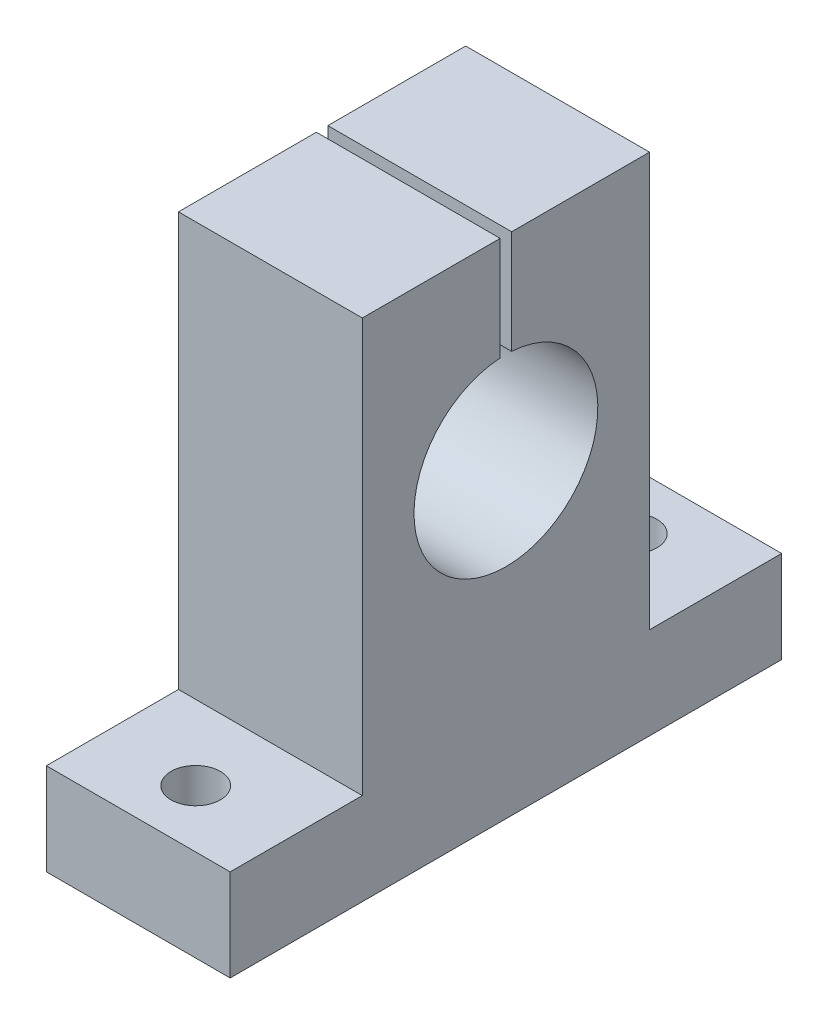
ISO-10303-21;
HEADER;
FILE_DESCRIPTION(('STEP AP214'),'2;1');
FILE_NAME('part.step','',(''),(''),'','','');
FILE_SCHEMA(('AUTOMOTIVE_DESIGN { 1 0 10303 214 1 1 1 1 }'));
ENDSEC;
DATA;
#1=APPLICATION_CONTEXT('core data for automotive mechanical design processes');
#2=APPLICATION_PROTOCOL_DEFINITION('international standard','automotive_design',2000,#1);
#3=PRODUCT_CONTEXT('',#1,'mechanical');
#4=PRODUCT('Part','Part','',(#3));
#5=PRODUCT_RELATED_PRODUCT_CATEGORY('part','',(#4));
#6=PRODUCT_DEFINITION_FORMATION('','',#4);
#7=PRODUCT_DEFINITION_CONTEXT('part definition',#1,'design');
#8=PRODUCT_DEFINITION('design','',#6,#7);
#9=PRODUCT_DEFINITION_SHAPE('','',#8);
#10=(LENGTH_UNIT() NAMED_UNIT(*) SI_UNIT(.MILLI.,.METRE.));
#11=(NAMED_UNIT(*) PLANE_ANGLE_UNIT() SI_UNIT($,.RADIAN.));
#12=(NAMED_UNIT(*) SI_UNIT($,.STERADIAN.) SOLID_ANGLE_UNIT());
#13=UNCERTAINTY_MEASURE_WITH_UNIT(LENGTH_MEASURE(1.E-05),#10,'distance_accuracy_value','');
#14=(GEOMETRIC_REPRESENTATION_CONTEXT(3) GLOBAL_UNCERTAINTY_ASSIGNED_CONTEXT((#13)) GLOBAL_UNIT_ASSIGNED_CONTEXT((#10,
#11,#12)) REPRESENTATION_CONTEXT('',''));
#15=CARTESIAN_POINT('',(0.,0.,0.));
#16=DIRECTION('',(0.,0.,1.));
#17=DIRECTION('',(1.,0.,0.));
#18=AXIS2_PLACEMENT_3D('',#15,#16,#17);
#19=CARTESIAN_POINT('',(16.,8.,24.));
#20=DIRECTION('',(0.,-1.,0.));
#21=DIRECTION('',(0.,0.,-1.));
#22=AXIS2_PLACEMENT_3D('',#19,#20,#21);
#23=PLANE('',#22);
#24=DIRECTION('',(0.,0.,1.));
#25=VECTOR('',#24,1.);
#26=CARTESIAN_POINT('',(0.,8.,24.));
#27=LINE('',#26,#25);
#28=CARTESIAN_POINT('',(0.,8.,12.5));
#29=VERTEX_POINT('',#28);
#30=CARTESIAN_POINT('',(0.,8.,24.));
#31=VERTEX_POINT('',#30);
#32=EDGE_CURVE('E100',#29,#31,#27,.T.);
#33=ORIENTED_EDGE('',*,*,#32,.T.);
#34=DIRECTION('',(-1.,0.,0.));
#35=VECTOR('',#34,1.);
#36=CARTESIAN_POINT('',(16.,8.,24.));
#37=LINE('',#36,#35);
#38=CARTESIAN_POINT('',(16.,8.,24.));
#39=VERTEX_POINT('',#38);
#40=EDGE_CURVE('E153',#39,#31,#37,.T.);
#41=ORIENTED_EDGE('',*,*,#40,.F.);
#42=DIRECTION('',(0.,0.,1.));
#43=VECTOR('',#42,1.);
#44=CARTESIAN_POINT('',(16.,8.,24.));
#45=LINE('',#44,#43);
#46=CARTESIAN_POINT('',(16.,8.,12.5));
#47=VERTEX_POINT('',#46);
#48=EDGE_CURVE('E53',#47,#39,#45,.T.);
#49=ORIENTED_EDGE('',*,*,#48,.F.);
#50=DIRECTION('',(-1.,0.,0.));
#51=VECTOR('',#50,1.);
#52=CARTESIAN_POINT('',(16.,8.,12.5));
#53=LINE('',#52,#51);
#54=EDGE_CURVE('E149',#47,#29,#53,.T.);
#55=ORIENTED_EDGE('',*,*,#54,.T.);
#56=EDGE_LOOP('',(#33,#41,#49,#55));
#57=FACE_BOUND('',#56,.T.);
#58=CARTESIAN_POINT('',(8.,8.,19.));
#59=DIRECTION('',(0.,1.,0.));
#60=DIRECTION('',(0.,0.,1.));
#61=AXIS2_PLACEMENT_3D('',#58,#59,#60);
#62=CIRCLE('',#61,2.14999999999999);
#63=CARTESIAN_POINT('',(8.,8.,21.15));
#64=VERTEX_POINT('',#63);
#65=EDGE_CURVE('E252',#64,#64,#62,.T.);
#66=ORIENTED_EDGE('',*,*,#65,.F.);
#67=EDGE_LOOP('',(#66));
#68=FACE_BOUND('',#67,.T.);
#69=ADVANCED_FACE('F36',(#57,#68),#23,.F.);
#70=CARTESIAN_POINT('',(16.,0.,24.));
#71=DIRECTION('',(0.,0.,-1.));
#72=DIRECTION('',(-1.,0.,0.));
#73=AXIS2_PLACEMENT_3D('',#70,#71,#72);
#74=PLANE('',#73);
#75=DIRECTION('',(0.,-1.,0.));
#76=VECTOR('',#75,1.);
#77=CARTESIAN_POINT('',(0.,0.,24.));
#78=LINE('',#77,#76);
#79=CARTESIAN_POINT('',(0.,0.,24.));
#80=VERTEX_POINT('',#79);
#81=EDGE_CURVE('E157',#31,#80,#78,.T.);
#82=ORIENTED_EDGE('',*,*,#81,.T.);
#83=DIRECTION('',(-1.,0.,0.));
#84=VECTOR('',#83,1.);
#85=CARTESIAN_POINT('',(16.,0.,24.));
#86=LINE('',#85,#84);
#87=CARTESIAN_POINT('',(16.,0.,24.));
#88=VERTEX_POINT('',#87);
#89=EDGE_CURVE('E11',#88,#80,#86,.T.);
#90=ORIENTED_EDGE('',*,*,#89,.F.);
#91=DIRECTION('',(0.,-1.,0.));
#92=VECTOR('',#91,1.);
#93=CARTESIAN_POINT('',(16.,0.,24.));
#94=LINE('',#93,#92);
#95=EDGE_CURVE('E180',#39,#88,#94,.T.);
#96=ORIENTED_EDGE('',*,*,#95,.F.);
#97=ORIENTED_EDGE('',*,*,#40,.T.);
#98=EDGE_LOOP('',(#82,#90,#96,#97));
#99=FACE_BOUND('',#98,.T.);
#100=ADVANCED_FACE('F38',(#99),#74,.F.);
#101=CARTESIAN_POINT('',(16.,0.,24.));
#102=DIRECTION('',(0.,1.,0.));
#103=DIRECTION('',(0.,0.,1.));
#104=AXIS2_PLACEMENT_3D('',#101,#102,#103);
#105=PLANE('',#104);
#106=CARTESIAN_POINT('',(8.,0.,-19.));
#107=DIRECTION('',(0.,1.,0.));
#108=DIRECTION('',(0.,0.,1.));
#109=AXIS2_PLACEMENT_3D('',#106,#107,#108);
#110=CIRCLE('',#109,2.15);
#111=CARTESIAN_POINT('',(8.,0.,-16.85));
#112=VERTEX_POINT('',#111);
#113=EDGE_CURVE('E254',#112,#112,#110,.T.);
#114=ORIENTED_EDGE('',*,*,#113,.T.);
#115=EDGE_LOOP('',(#114));
#116=FACE_BOUND('',#115,.T.);
#117=CARTESIAN_POINT('',(8.,0.,19.));
#118=DIRECTION('',(0.,1.,0.));
#119=DIRECTION('',(0.,0.,1.));
#120=AXIS2_PLACEMENT_3D('',#117,#118,#119);
#121=CIRCLE('',#120,2.15);
#122=CARTESIAN_POINT('',(8.,0.,21.15));
#123=VERTEX_POINT('',#122);
#124=EDGE_CURVE('E161',#123,#123,#121,.T.);
#125=ORIENTED_EDGE('',*,*,#124,.T.);
#126=EDGE_LOOP('',(#125));
#127=FACE_BOUND('',#126,.T.);
#128=DIRECTION('',(0.,0.,-1.));
#129=VECTOR('',#128,1.);
#130=CARTESIAN_POINT('',(0.,0.,24.));
#131=LINE('',#130,#129);
#132=CARTESIAN_POINT('',(0.,0.,-24.));
#133=VERTEX_POINT('',#132);
#134=EDGE_CURVE('E160',#80,#133,#131,.T.);
#135=ORIENTED_EDGE('',*,*,#134,.T.);
#136=DIRECTION('',(-1.,0.,0.));
#137=VECTOR('',#136,1.);
#138=CARTESIAN_POINT('',(16.,0.,-24.));
#139=LINE('',#138,#137);
#140=CARTESIAN_POINT('',(16.,0.,-24.));
#141=VERTEX_POINT('',#140);
#142=EDGE_CURVE('E45',#141,#133,#139,.T.);
#143=ORIENTED_EDGE('',*,*,#142,.F.);
#144=DIRECTION('',(0.,0.,-1.));
#145=VECTOR('',#144,1.);
#146=CARTESIAN_POINT('',(16.,0.,24.));
#147=LINE('',#146,#145);
#148=EDGE_CURVE('E108',#88,#141,#147,.T.);
#149=ORIENTED_EDGE('',*,*,#148,.F.);
#150=ORIENTED_EDGE('',*,*,#89,.T.);
#151=EDGE_LOOP('',(#135,#143,#149,#150));
#152=FACE_BOUND('',#151,.T.);
#153=ADVANCED_FACE('F277',(#116,#127,#152),#105,.F.);
#154=CARTESIAN_POINT('',(16.,0.,-24.));
#155=DIRECTION('',(0.,0.,1.));
#156=DIRECTION('',(0.,-1.,0.));
#157=AXIS2_PLACEMENT_3D('',#154,#155,#156);
#158=PLANE('',#157);
#159=DIRECTION('',(0.,1.,0.));
#160=VECTOR('',#159,1.);
#161=CARTESIAN_POINT('',(0.,0.,-24.));
#162=LINE('',#161,#160);
#163=CARTESIAN_POINT('',(0.,8.00000000000001,-24.));
#164=VERTEX_POINT('',#163);
#165=EDGE_CURVE('E163',#133,#164,#162,.T.);
#166=ORIENTED_EDGE('',*,*,#165,.T.);
#167=DIRECTION('',(-1.,0.,0.));
#168=VECTOR('',#167,1.);
#169=CARTESIAN_POINT('',(16.,8.00000000000001,-24.));
#170=LINE('',#169,#168);
#171=CARTESIAN_POINT('',(16.,8.00000000000001,-24.));
#172=VERTEX_POINT('',#171);
#173=EDGE_CURVE('E199',#172,#164,#170,.T.);
#174=ORIENTED_EDGE('',*,*,#173,.F.);
#175=DIRECTION('',(0.,1.,0.));
#176=VECTOR('',#175,1.);
#177=CARTESIAN_POINT('',(16.,0.,-24.));
#178=LINE('',#177,#176);
#179=EDGE_CURVE('E207',#141,#172,#178,.T.);
#180=ORIENTED_EDGE('',*,*,#179,.F.);
#181=ORIENTED_EDGE('',*,*,#142,.T.);
#182=EDGE_LOOP('',(#166,#174,#180,#181));
#183=FACE_BOUND('',#182,.T.);
#184=ADVANCED_FACE('F205',(#183),#158,.F.);
#185=CARTESIAN_POINT('',(16.,8.,-12.5));
#186=DIRECTION('',(0.,-1.,0.));
#187=DIRECTION('',(0.,0.,-1.));
#188=AXIS2_PLACEMENT_3D('',#185,#186,#187);
#189=PLANE('',#188);
#190=CARTESIAN_POINT('',(8.,8.00000000000001,-19.));
#191=DIRECTION('',(0.,1.,0.));
#192=DIRECTION('',(0.,0.,1.));
#193=AXIS2_PLACEMENT_3D('',#190,#191,#192);
#194=CIRCLE('',#193,2.14999999999999);
#195=CARTESIAN_POINT('',(8.,8.00000000000001,-16.85));
#196=VERTEX_POINT('',#195);
#197=EDGE_CURVE('E259',#196,#196,#194,.T.);
#198=ORIENTED_EDGE('',*,*,#197,.F.);
#199=EDGE_LOOP('',(#198));
#200=FACE_BOUND('',#199,.T.);
#201=DIRECTION('',(0.,0.,1.));
#202=VECTOR('',#201,1.);
#203=CARTESIAN_POINT('',(0.,8.,-12.5));
#204=LINE('',#203,#202);
#205=CARTESIAN_POINT('',(0.,8.,-12.5));
#206=VERTEX_POINT('',#205);
#207=EDGE_CURVE('E165',#164,#206,#204,.T.);
#208=ORIENTED_EDGE('',*,*,#207,.T.);
#209=DIRECTION('',(-1.,0.,0.));
#210=VECTOR('',#209,1.);
#211=CARTESIAN_POINT('',(16.,8.,-12.5));
#212=LINE('',#211,#210);
#213=CARTESIAN_POINT('',(16.,8.,-12.5));
#214=VERTEX_POINT('',#213);
#215=EDGE_CURVE('E196',#214,#206,#212,.T.);
#216=ORIENTED_EDGE('',*,*,#215,.F.);
#217=DIRECTION('',(0.,0.,1.));
#218=VECTOR('',#217,1.);
#219=CARTESIAN_POINT('',(16.,8.,-12.5));
#220=LINE('',#219,#218);
#221=EDGE_CURVE('E225',#172,#214,#220,.T.);
#222=ORIENTED_EDGE('',*,*,#221,.F.);
#223=ORIENTED_EDGE('',*,*,#173,.T.);
#224=EDGE_LOOP('',(#208,#216,#222,#223));
#225=FACE_BOUND('',#224,.T.);
#226=ADVANCED_FACE('F216',(#200,#225),#189,.F.);
#227=CARTESIAN_POINT('',(16.,8.,-12.5));
#228=DIRECTION('',(0.,0.,1.));
#229=DIRECTION('',(0.,-1.,0.));
#230=AXIS2_PLACEMENT_3D('',#227,#228,#229);
#231=PLANE('',#230);
#232=DIRECTION('',(0.,1.,0.));
#233=VECTOR('',#232,1.);
#234=CARTESIAN_POINT('',(0.,8.,-12.5));
#235=LINE('',#234,#233);
#236=CARTESIAN_POINT('',(0.,44.,-12.5));
#237=VERTEX_POINT('',#236);
#238=EDGE_CURVE('E167',#206,#237,#235,.T.);
#239=ORIENTED_EDGE('',*,*,#238,.T.);
#240=DIRECTION('',(-1.,0.,0.));
#241=VECTOR('',#240,1.);
#242=CARTESIAN_POINT('',(16.,44.,-12.5));
#243=LINE('',#242,#241);
#244=CARTESIAN_POINT('',(16.,44.,-12.5));
#245=VERTEX_POINT('',#244);
#246=EDGE_CURVE('E193',#245,#237,#243,.T.);
#247=ORIENTED_EDGE('',*,*,#246,.F.);
#248=DIRECTION('',(0.,1.,0.));
#249=VECTOR('',#248,1.);
#250=CARTESIAN_POINT('',(16.,8.,-12.5));
#251=LINE('',#250,#249);
#252=EDGE_CURVE('E222',#214,#245,#251,.T.);
#253=ORIENTED_EDGE('',*,*,#252,.F.);
#254=ORIENTED_EDGE('',*,*,#215,.T.);
#255=EDGE_LOOP('',(#239,#247,#253,#254));
#256=FACE_BOUND('',#255,.T.);
#257=ADVANCED_FACE('F220',(#256),#231,.F.);
#258=CARTESIAN_POINT('',(16.,44.,-0.5));
#259=DIRECTION('',(0.,-1.,0.));
#260=DIRECTION('',(0.,0.,-1.));
#261=AXIS2_PLACEMENT_3D('',#258,#259,#260);
#262=PLANE('',#261);
#263=DIRECTION('',(0.,0.,1.));
#264=VECTOR('',#263,1.);
#265=CARTESIAN_POINT('',(0.,44.,-0.5));
#266=LINE('',#265,#264);
#267=CARTESIAN_POINT('',(0.,44.,-0.5));
#268=VERTEX_POINT('',#267);
#269=EDGE_CURVE('E169',#237,#268,#266,.T.);
#270=ORIENTED_EDGE('',*,*,#269,.T.);
#271=DIRECTION('',(-1.,0.,0.));
#272=VECTOR('',#271,1.);
#273=CARTESIAN_POINT('',(16.,44.,-0.5));
#274=LINE('',#273,#272);
#275=CARTESIAN_POINT('',(16.,44.,-0.5));
#276=VERTEX_POINT('',#275);
#277=EDGE_CURVE('E190',#276,#268,#274,.T.);
#278=ORIENTED_EDGE('',*,*,#277,.F.);
#279=DIRECTION('',(0.,0.,1.));
#280=VECTOR('',#279,1.);
#281=CARTESIAN_POINT('',(16.,44.,-0.5));
#282=LINE('',#281,#280);
#283=EDGE_CURVE('E224',#245,#276,#282,.T.);
#284=ORIENTED_EDGE('',*,*,#283,.F.);
#285=ORIENTED_EDGE('',*,*,#246,.T.);
#286=EDGE_LOOP('',(#270,#278,#284,#285));
#287=FACE_BOUND('',#286,.T.);
#288=ADVANCED_FACE('F275',(#287),#262,.F.);
#289=CARTESIAN_POINT('',(16.,44.,-0.5));
#290=DIRECTION('',(0.,0.,-1.));
#291=DIRECTION('',(0.,1.,0.));
#292=AXIS2_PLACEMENT_3D('',#289,#290,#291);
#293=PLANE('',#292);
#294=DIRECTION('',(0.,-1.,0.));
#295=VECTOR('',#294,1.);
#296=CARTESIAN_POINT('',(0.,44.,-0.5));
#297=LINE('',#296,#295);
#298=CARTESIAN_POINT('',(0.,34.9843597113357,-0.500000000000001));
#299=VERTEX_POINT('',#298);
#300=EDGE_CURVE('E171',#268,#299,#297,.T.);
#301=ORIENTED_EDGE('',*,*,#300,.T.);
#302=DIRECTION('',(-1.,0.,0.));
#303=VECTOR('',#302,1.);
#304=CARTESIAN_POINT('',(16.,34.9843597113357,-0.500000000000001));
#305=LINE('',#304,#303);
#306=CARTESIAN_POINT('',(16.,34.9843597113357,-0.500000000000001));
#307=VERTEX_POINT('',#306);
#308=EDGE_CURVE('E187',#307,#299,#305,.T.);
#309=ORIENTED_EDGE('',*,*,#308,.F.);
#310=DIRECTION('',(0.,-1.,0.));
#311=VECTOR('',#310,1.);
#312=CARTESIAN_POINT('',(16.,44.,-0.5));
#313=LINE('',#312,#311);
#314=EDGE_CURVE('E227',#276,#307,#313,.T.);
#315=ORIENTED_EDGE('',*,*,#314,.F.);
#316=ORIENTED_EDGE('',*,*,#277,.T.);
#317=EDGE_LOOP('',(#301,#309,#315,#316));
#318=FACE_BOUND('',#317,.T.);
#319=ADVANCED_FACE('F310',(#318),#293,.F.);
#320=CARTESIAN_POINT('',(16.,27.,0.));
#321=DIRECTION('',(-1.,0.,0.));
#322=DIRECTION('',(0.,0.,1.));
#323=AXIS2_PLACEMENT_3D('',#320,#321,#322);
#324=CYLINDRICAL_SURFACE('',#323,8.);
#325=CARTESIAN_POINT('',(0.,27.,0.));
#326=DIRECTION('',(-1.,0.,0.));
#327=DIRECTION('',(0.,0.,-1.));
#328=AXIS2_PLACEMENT_3D('',#325,#326,#327);
#329=CIRCLE('',#328,8.);
#330=CARTESIAN_POINT('',(0.,34.9843597113357,0.499999999999999));
#331=VERTEX_POINT('',#330);
#332=EDGE_CURVE('E173',#299,#331,#329,.T.);
#333=ORIENTED_EDGE('',*,*,#332,.T.);
#334=DIRECTION('',(-1.,0.,0.));
#335=VECTOR('',#334,1.);
#336=CARTESIAN_POINT('',(16.,34.9843597113357,0.499999999999999));
#337=LINE('',#336,#335);
#338=CARTESIAN_POINT('',(16.,34.9843597113357,0.499999999999999));
#339=VERTEX_POINT('',#338);
#340=EDGE_CURVE('E184',#339,#331,#337,.T.);
#341=ORIENTED_EDGE('',*,*,#340,.F.);
#342=CARTESIAN_POINT('',(16.,27.,0.));
#343=DIRECTION('',(-1.,0.,0.));
#344=DIRECTION('',(0.,0.,-1.));
#345=AXIS2_PLACEMENT_3D('',#342,#343,#344);
#346=CIRCLE('',#345,8.);
#347=EDGE_CURVE('E233',#307,#339,#346,.T.);
#348=ORIENTED_EDGE('',*,*,#347,.F.);
#349=ORIENTED_EDGE('',*,*,#308,.T.);
#350=EDGE_LOOP('',(#333,#341,#348,#349));
#351=FACE_BOUND('',#350,.T.);
#352=ADVANCED_FACE('F239',(#351),#324,.F.);
#353=CARTESIAN_POINT('',(16.,44.,0.5));
#354=DIRECTION('',(0.,0.,1.));
#355=DIRECTION('',(0.,-1.,0.));
#356=AXIS2_PLACEMENT_3D('',#353,#354,#355);
#357=PLANE('',#356);
#358=DIRECTION('',(0.,1.,0.));
#359=VECTOR('',#358,1.);
#360=CARTESIAN_POINT('',(0.,44.,0.5));
#361=LINE('',#360,#359);
#362=CARTESIAN_POINT('',(0.,44.,0.5));
#363=VERTEX_POINT('',#362);
#364=EDGE_CURVE('E175',#331,#363,#361,.T.);
#365=ORIENTED_EDGE('',*,*,#364,.T.);
#366=DIRECTION('',(-1.,0.,0.));
#367=VECTOR('',#366,1.);
#368=CARTESIAN_POINT('',(16.,44.,0.5));
#369=LINE('',#368,#367);
#370=CARTESIAN_POINT('',(16.,44.,0.5));
#371=VERTEX_POINT('',#370);
#372=EDGE_CURVE('E148',#371,#363,#369,.T.);
#373=ORIENTED_EDGE('',*,*,#372,.F.);
#374=DIRECTION('',(0.,1.,0.));
#375=VECTOR('',#374,1.);
#376=CARTESIAN_POINT('',(16.,44.,0.5));
#377=LINE('',#376,#375);
#378=EDGE_CURVE('E139',#339,#371,#377,.T.);
#379=ORIENTED_EDGE('',*,*,#378,.F.);
#380=ORIENTED_EDGE('',*,*,#340,.T.);
#381=EDGE_LOOP('',(#365,#373,#379,#380));
#382=FACE_BOUND('',#381,.T.);
#383=ADVANCED_FACE('F243',(#382),#357,.F.);
#384=CARTESIAN_POINT('',(16.,44.,12.5));
#385=DIRECTION('',(0.,-1.,0.));
#386=DIRECTION('',(0.,0.,-1.));
#387=AXIS2_PLACEMENT_3D('',#384,#385,#386);
#388=PLANE('',#387);
#389=DIRECTION('',(0.,0.,1.));
#390=VECTOR('',#389,1.);
#391=CARTESIAN_POINT('',(0.,44.,12.5));
#392=LINE('',#391,#390);
#393=CARTESIAN_POINT('',(0.,44.,12.5));
#394=VERTEX_POINT('',#393);
#395=EDGE_CURVE('E147',#363,#394,#392,.T.);
#396=ORIENTED_EDGE('',*,*,#395,.T.);
#397=DIRECTION('',(-1.,0.,0.));
#398=VECTOR('',#397,1.);
#399=CARTESIAN_POINT('',(16.,44.,12.5));
#400=LINE('',#399,#398);
#401=CARTESIAN_POINT('',(16.,44.,12.5));
#402=VERTEX_POINT('',#401);
#403=EDGE_CURVE('E144',#402,#394,#400,.T.);
#404=ORIENTED_EDGE('',*,*,#403,.F.);
#405=DIRECTION('',(0.,0.,1.));
#406=VECTOR('',#405,1.);
#407=CARTESIAN_POINT('',(16.,44.,12.5));
#408=LINE('',#407,#406);
#409=EDGE_CURVE('E133',#371,#402,#408,.T.);
#410=ORIENTED_EDGE('',*,*,#409,.F.);
#411=ORIENTED_EDGE('',*,*,#372,.T.);
#412=EDGE_LOOP('',(#396,#404,#410,#411));
#413=FACE_BOUND('',#412,.T.);
#414=ADVANCED_FACE('F145',(#413),#388,.F.);
#415=CARTESIAN_POINT('',(16.,8.,12.5));
#416=DIRECTION('',(0.,0.,-1.));
#417=DIRECTION('',(-1.,0.,0.));
#418=AXIS2_PLACEMENT_3D('',#415,#416,#417);
#419=PLANE('',#418);
#420=DIRECTION('',(0.,-1.,0.));
#421=VECTOR('',#420,1.);
#422=CARTESIAN_POINT('',(0.,8.,12.5));
#423=LINE('',#422,#421);
#424=EDGE_CURVE('E94',#394,#29,#423,.T.);
#425=ORIENTED_EDGE('',*,*,#424,.T.);
#426=ORIENTED_EDGE('',*,*,#54,.F.);
#427=DIRECTION('',(0.,-1.,0.));
#428=VECTOR('',#427,1.);
#429=CARTESIAN_POINT('',(16.,8.,12.5));
#430=LINE('',#429,#428);
#431=EDGE_CURVE('E137',#402,#47,#430,.T.);
#432=ORIENTED_EDGE('',*,*,#431,.F.);
#433=ORIENTED_EDGE('',*,*,#403,.T.);
#434=EDGE_LOOP('',(#425,#426,#432,#433));
#435=FACE_BOUND('',#434,.T.);
#436=ADVANCED_FACE('F151',(#435),#419,.F.);
#437=CARTESIAN_POINT('',(16.,27.,0.));
#438=DIRECTION('',(1.,0.,0.));
#439=DIRECTION('',(0.,0.,-1.));
#440=AXIS2_PLACEMENT_3D('',#437,#438,#439);
#441=PLANE('',#440);
#442=ORIENTED_EDGE('',*,*,#95,.T.);
#443=ORIENTED_EDGE('',*,*,#148,.T.);
#444=ORIENTED_EDGE('',*,*,#179,.T.);
#445=ORIENTED_EDGE('',*,*,#221,.T.);
#446=ORIENTED_EDGE('',*,*,#252,.T.);
#447=ORIENTED_EDGE('',*,*,#283,.T.);
#448=ORIENTED_EDGE('',*,*,#314,.T.);
#449=ORIENTED_EDGE('',*,*,#347,.T.);
#450=ORIENTED_EDGE('',*,*,#378,.T.);
#451=ORIENTED_EDGE('',*,*,#409,.T.);
#452=ORIENTED_EDGE('',*,*,#431,.T.);
#453=ORIENTED_EDGE('',*,*,#48,.T.);
#454=EDGE_LOOP('',(#442,#443,#444,#445,#446,#447,#448,#449,#450,#451,#452,#453));
#455=FACE_BOUND('',#454,.T.);
#456=ADVANCED_FACE('F135',(#455),#441,.T.);
#457=CARTESIAN_POINT('',(0.,27.,0.));
#458=DIRECTION('',(1.,0.,0.));
#459=DIRECTION('',(0.,0.,-1.));
#460=AXIS2_PLACEMENT_3D('',#457,#458,#459);
#461=PLANE('',#460);
#462=ORIENTED_EDGE('',*,*,#81,.F.);
#463=ORIENTED_EDGE('',*,*,#32,.F.);
#464=ORIENTED_EDGE('',*,*,#424,.F.);
#465=ORIENTED_EDGE('',*,*,#395,.F.);
#466=ORIENTED_EDGE('',*,*,#364,.F.);
#467=ORIENTED_EDGE('',*,*,#332,.F.);
#468=ORIENTED_EDGE('',*,*,#300,.F.);
#469=ORIENTED_EDGE('',*,*,#269,.F.);
#470=ORIENTED_EDGE('',*,*,#238,.F.);
#471=ORIENTED_EDGE('',*,*,#207,.F.);
#472=ORIENTED_EDGE('',*,*,#165,.F.);
#473=ORIENTED_EDGE('',*,*,#134,.F.);
#474=EDGE_LOOP('',(#462,#463,#464,#465,#466,#467,#468,#469,#470,#471,#472,#473));
#475=FACE_BOUND('',#474,.T.);
#476=ADVANCED_FACE('F211',(#475),#461,.F.);
#477=CARTESIAN_POINT('',(8.,7.99999999999999,19.));
#478=DIRECTION('',(0.,1.,0.));
#479=DIRECTION('',(0.,0.,1.));
#480=AXIS2_PLACEMENT_3D('',#477,#478,#479);
#481=CYLINDRICAL_SURFACE('',#480,2.14999999999999);
#482=ORIENTED_EDGE('',*,*,#124,.F.);
#483=EDGE_LOOP('',(#482));
#484=FACE_BOUND('',#483,.T.);
#485=ORIENTED_EDGE('',*,*,#65,.T.);
#486=EDGE_LOOP('',(#485));
#487=FACE_BOUND('',#486,.T.);
#488=ADVANCED_FACE('F289',(#484,#487),#481,.F.);
#489=CARTESIAN_POINT('',(8.,8.00000000000001,-19.));
#490=DIRECTION('',(0.,1.,0.));
#491=DIRECTION('',(0.,0.,1.));
#492=AXIS2_PLACEMENT_3D('',#489,#490,#491);
#493=CYLINDRICAL_SURFACE('',#492,2.14999999999999);
#494=ORIENTED_EDGE('',*,*,#113,.F.);
#495=EDGE_LOOP('',(#494));
#496=FACE_BOUND('',#495,.T.);
#497=ORIENTED_EDGE('',*,*,#197,.T.);
#498=EDGE_LOOP('',(#497));
#499=FACE_BOUND('',#498,.T.);
#500=ADVANCED_FACE('F267',(#496,#499),#493,.F.);
#501=CLOSED_SHELL('',(#69,#100,#153,#184,#226,#257,#288,#319,#352,#383,#414,#436,#456,#476,#488,#500));
#502=MANIFOLD_SOLID_BREP('B2',#501);
#503=ADVANCED_BREP_SHAPE_REPRESENTATION('',(#18,#502),#14);
#504=SHAPE_DEFINITION_REPRESENTATION(#9,#503);
ENDSEC;
END-ISO-10303-21;
